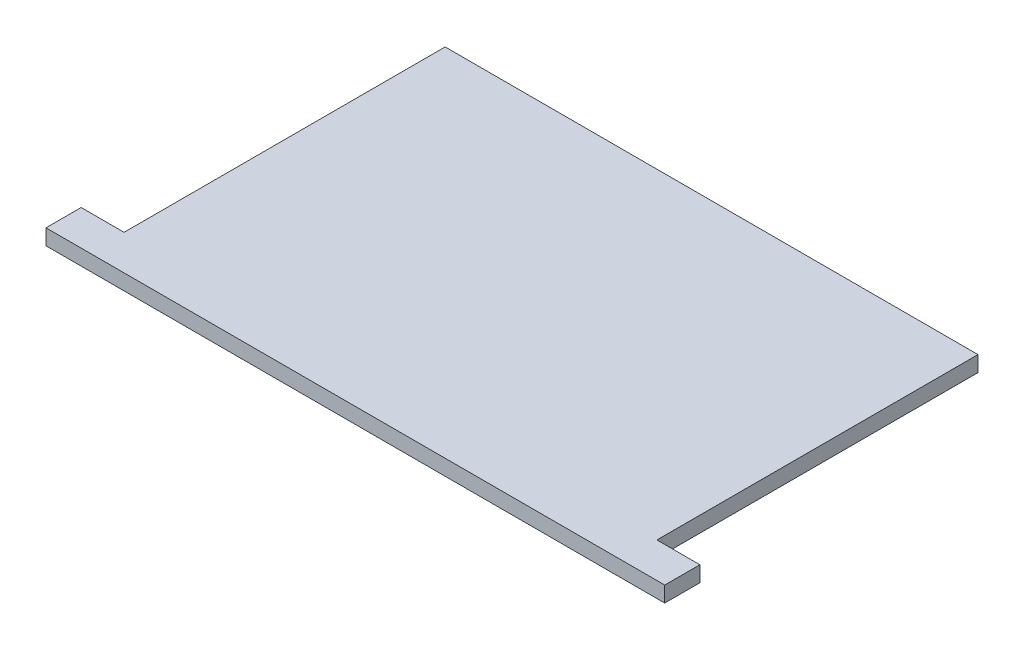
ISO-10303-21;
HEADER;
FILE_DESCRIPTION(('STEP AP214'),'2;1');
FILE_NAME('part.step','',(''),(''),'','','');
FILE_SCHEMA(('AUTOMOTIVE_DESIGN { 1 0 10303 214 1 1 1 1 }'));
ENDSEC;
DATA;
#1=APPLICATION_CONTEXT('core data for automotive mechanical design processes');
#2=APPLICATION_PROTOCOL_DEFINITION('international standard','automotive_design',2000,#1);
#3=PRODUCT_CONTEXT('',#1,'mechanical');
#4=PRODUCT('Part','Part','',(#3));
#5=PRODUCT_RELATED_PRODUCT_CATEGORY('part','',(#4));
#6=PRODUCT_DEFINITION_FORMATION('','',#4);
#7=PRODUCT_DEFINITION_CONTEXT('part definition',#1,'design');
#8=PRODUCT_DEFINITION('design','',#6,#7);
#9=PRODUCT_DEFINITION_SHAPE('','',#8);
#10=(LENGTH_UNIT() NAMED_UNIT(*) SI_UNIT(.MILLI.,.METRE.));
#11=(NAMED_UNIT(*) PLANE_ANGLE_UNIT() SI_UNIT($,.RADIAN.));
#12=(NAMED_UNIT(*) SI_UNIT($,.STERADIAN.) SOLID_ANGLE_UNIT());
#13=UNCERTAINTY_MEASURE_WITH_UNIT(LENGTH_MEASURE(1.E-05),#10,'distance_accuracy_value','');
#14=(GEOMETRIC_REPRESENTATION_CONTEXT(3) GLOBAL_UNCERTAINTY_ASSIGNED_CONTEXT((#13)) GLOBAL_UNIT_ASSIGNED_CONTEXT((#10,
#11,#12)) REPRESENTATION_CONTEXT('',''));
#15=CARTESIAN_POINT('',(0.,0.,0.));
#16=DIRECTION('',(0.,0.,1.));
#17=DIRECTION('',(1.,0.,0.));
#18=AXIS2_PLACEMENT_3D('',#15,#16,#17);
#19=CARTESIAN_POINT('',(-158.5,0.,73.25));
#20=DIRECTION('',(0.,0.,1.));
#21=DIRECTION('',(1.,0.,0.));
#22=AXIS2_PLACEMENT_3D('',#19,#20,#21);
#23=PLANE('',#22);
#24=DIRECTION('',(1.,0.,0.));
#25=VECTOR('',#24,1.);
#26=CARTESIAN_POINT('',(-158.5,0.,73.25));
#27=LINE('',#26,#25);
#28=CARTESIAN_POINT('',(136.5,0.,73.2499999999998));
#29=VERTEX_POINT('',#28);
#30=CARTESIAN_POINT('',(158.5,0.,73.25));
#31=VERTEX_POINT('',#30);
#32=EDGE_CURVE('E185',#29,#31,#27,.T.);
#33=ORIENTED_EDGE('',*,*,#32,.F.);
#34=DIRECTION('',(0.,1.,0.));
#35=VECTOR('',#34,1.);
#36=CARTESIAN_POINT('',(136.5,0.,73.25));
#37=LINE('',#36,#35);
#38=CARTESIAN_POINT('',(136.5,8.,73.25));
#39=VERTEX_POINT('',#38);
#40=EDGE_CURVE('E179',#29,#39,#37,.T.);
#41=ORIENTED_EDGE('',*,*,#40,.T.);
#42=DIRECTION('',(1.,0.,0.));
#43=VECTOR('',#42,1.);
#44=CARTESIAN_POINT('',(158.5,8.,73.25));
#45=LINE('',#44,#43);
#46=CARTESIAN_POINT('',(158.5,8.,73.25));
#47=VERTEX_POINT('',#46);
#48=EDGE_CURVE('E173',#39,#47,#45,.T.);
#49=ORIENTED_EDGE('',*,*,#48,.T.);
#50=DIRECTION('',(0.,1.,0.));
#51=VECTOR('',#50,1.);
#52=CARTESIAN_POINT('',(158.5,0.,73.25));
#53=LINE('',#52,#51);
#54=EDGE_CURVE('E175',#31,#47,#53,.T.);
#55=ORIENTED_EDGE('',*,*,#54,.F.);
#56=EDGE_LOOP('',(#33,#41,#49,#55));
#57=FACE_BOUND('',#56,.T.);
#58=ADVANCED_FACE('F35',(#57),#23,.F.);
#59=DIRECTION('',(0.,1.,0.));
#60=VECTOR('',#59,1.);
#61=CARTESIAN_POINT('',(116.5,0.,73.25));
#62=LINE('',#61,#60);
#63=CARTESIAN_POINT('',(116.5,0.,73.2499999999998));
#64=VERTEX_POINT('',#63);
#65=CARTESIAN_POINT('',(116.5,6.,73.25));
#66=VERTEX_POINT('',#65);
#67=EDGE_CURVE('E141',#64,#66,#62,.T.);
#68=ORIENTED_EDGE('',*,*,#67,.F.);
#69=CARTESIAN_POINT('',(-116.5,0.,73.25));
#70=VERTEX_POINT('',#69);
#71=EDGE_CURVE('E132',#70,#64,#27,.T.);
#72=ORIENTED_EDGE('',*,*,#71,.F.);
#73=DIRECTION('',(0.,1.,0.));
#74=VECTOR('',#73,1.);
#75=CARTESIAN_POINT('',(-116.5,0.,73.25));
#76=LINE('',#75,#74);
#77=CARTESIAN_POINT('',(-116.5,6.,73.25));
#78=VERTEX_POINT('',#77);
#79=EDGE_CURVE('E159',#70,#78,#76,.T.);
#80=ORIENTED_EDGE('',*,*,#79,.T.);
#81=DIRECTION('',(-1.,0.,0.));
#82=VECTOR('',#81,1.);
#83=CARTESIAN_POINT('',(-136.5,6.,73.25));
#84=LINE('',#83,#82);
#85=EDGE_CURVE('E168',#66,#78,#84,.T.);
#86=ORIENTED_EDGE('',*,*,#85,.F.);
#87=EDGE_LOOP('',(#68,#72,#80,#86));
#88=FACE_BOUND('',#87,.T.);
#89=ADVANCED_FACE('F247',(#88),#23,.F.);
#90=CARTESIAN_POINT('',(0.,6.,0.));
#91=DIRECTION('',(0.,1.,0.));
#92=DIRECTION('',(0.,0.,1.));
#93=AXIS2_PLACEMENT_3D('',#90,#91,#92);
#94=PLANE('',#93);
#95=DIRECTION('',(0.,0.,-1.));
#96=VECTOR('',#95,1.);
#97=CARTESIAN_POINT('',(116.5,6.,73.25));
#98=LINE('',#97,#96);
#99=CARTESIAN_POINT('',(116.5,6.,-91.25));
#100=VERTEX_POINT('',#99);
#101=EDGE_CURVE('E50',#66,#100,#98,.T.);
#102=ORIENTED_EDGE('',*,*,#101,.F.);
#103=ORIENTED_EDGE('',*,*,#85,.T.);
#104=DIRECTION('',(0.,0.,1.));
#105=VECTOR('',#104,1.);
#106=CARTESIAN_POINT('',(-116.5,6.,-91.25));
#107=LINE('',#106,#105);
#108=CARTESIAN_POINT('',(-116.5,6.,-91.25));
#109=VERTEX_POINT('',#108);
#110=EDGE_CURVE('E151',#109,#78,#107,.T.);
#111=ORIENTED_EDGE('',*,*,#110,.F.);
#112=DIRECTION('',(1.,0.,0.));
#113=VECTOR('',#112,1.);
#114=CARTESIAN_POINT('',(-136.5,6.,-91.25));
#115=LINE('',#114,#113);
#116=EDGE_CURVE('E55',#109,#100,#115,.T.);
#117=ORIENTED_EDGE('',*,*,#116,.T.);
#118=EDGE_LOOP('',(#102,#103,#111,#117));
#119=FACE_BOUND('',#118,.T.);
#120=ADVANCED_FACE('F248',(#119),#94,.F.);
#121=DIRECTION('',(0.,1.,0.));
#122=VECTOR('',#121,1.);
#123=CARTESIAN_POINT('',(-136.5,0.,73.25));
#124=LINE('',#123,#122);
#125=CARTESIAN_POINT('',(-136.5,0.,73.25));
#126=VERTEX_POINT('',#125);
#127=CARTESIAN_POINT('',(-136.5,8.,73.25));
#128=VERTEX_POINT('',#127);
#129=EDGE_CURVE('E194',#126,#128,#124,.T.);
#130=ORIENTED_EDGE('',*,*,#129,.F.);
#131=CARTESIAN_POINT('',(-158.5,0.,73.25));
#132=VERTEX_POINT('',#131);
#133=EDGE_CURVE('E182',#132,#126,#27,.T.);
#134=ORIENTED_EDGE('',*,*,#133,.F.);
#135=DIRECTION('',(0.,1.,0.));
#136=VECTOR('',#135,1.);
#137=CARTESIAN_POINT('',(-158.5,0.,73.25));
#138=LINE('',#137,#136);
#139=CARTESIAN_POINT('',(-158.5,8.,73.25));
#140=VERTEX_POINT('',#139);
#141=EDGE_CURVE('E184',#132,#140,#138,.T.);
#142=ORIENTED_EDGE('',*,*,#141,.T.);
#143=DIRECTION('',(1.,0.,0.));
#144=VECTOR('',#143,1.);
#145=CARTESIAN_POINT('',(-158.5,8.,73.25));
#146=LINE('',#145,#144);
#147=EDGE_CURVE('E178',#140,#128,#146,.T.);
#148=ORIENTED_EDGE('',*,*,#147,.T.);
#149=EDGE_LOOP('',(#130,#134,#142,#148));
#150=FACE_BOUND('',#149,.T.);
#151=ADVANCED_FACE('F250',(#150),#23,.F.);
#152=CARTESIAN_POINT('',(158.5,8.,91.25));
#153=DIRECTION('',(-1.,0.,0.));
#154=DIRECTION('',(0.,0.,1.));
#155=AXIS2_PLACEMENT_3D('',#152,#153,#154);
#156=PLANE('',#155);
#157=DIRECTION('',(0.,0.,-1.));
#158=VECTOR('',#157,1.);
#159=CARTESIAN_POINT('',(158.5,0.,91.25));
#160=LINE('',#159,#158);
#161=CARTESIAN_POINT('',(158.5,0.,91.25));
#162=VERTEX_POINT('',#161);
#163=EDGE_CURVE('E193',#162,#31,#160,.T.);
#164=ORIENTED_EDGE('',*,*,#163,.T.);
#165=ORIENTED_EDGE('',*,*,#54,.T.);
#166=DIRECTION('',(0.,0.,-1.));
#167=VECTOR('',#166,1.);
#168=CARTESIAN_POINT('',(158.5,8.,91.25));
#169=LINE('',#168,#167);
#170=CARTESIAN_POINT('',(158.5,8.,91.25));
#171=VERTEX_POINT('',#170);
#172=EDGE_CURVE('E197',#171,#47,#169,.T.);
#173=ORIENTED_EDGE('',*,*,#172,.F.);
#174=DIRECTION('',(0.,-1.,0.));
#175=VECTOR('',#174,1.);
#176=CARTESIAN_POINT('',(158.5,8.,91.25));
#177=LINE('',#176,#175);
#178=EDGE_CURVE('E43',#171,#162,#177,.T.);
#179=ORIENTED_EDGE('',*,*,#178,.T.);
#180=EDGE_LOOP('',(#164,#165,#173,#179));
#181=FACE_BOUND('',#180,.T.);
#182=ADVANCED_FACE('F37',(#181),#156,.F.);
#183=CARTESIAN_POINT('',(-158.5,8.,-91.25));
#184=DIRECTION('',(0.,0.,1.));
#185=DIRECTION('',(1.,0.,0.));
#186=AXIS2_PLACEMENT_3D('',#183,#184,#185);
#187=PLANE('',#186);
#188=DIRECTION('',(0.,1.,0.));
#189=VECTOR('',#188,1.);
#190=CARTESIAN_POINT('',(136.5,0.,-91.25));
#191=LINE('',#190,#189);
#192=CARTESIAN_POINT('',(136.5,0.,-91.25));
#193=VERTEX_POINT('',#192);
#194=CARTESIAN_POINT('',(136.5,8.,-91.25));
#195=VERTEX_POINT('',#194);
#196=EDGE_CURVE('E145',#193,#195,#191,.T.);
#197=ORIENTED_EDGE('',*,*,#196,.F.);
#198=DIRECTION('',(1.,0.,0.));
#199=VECTOR('',#198,1.);
#200=CARTESIAN_POINT('',(136.5,0.,-91.25));
#201=LINE('',#200,#199);
#202=CARTESIAN_POINT('',(116.5,0.,-91.25));
#203=VERTEX_POINT('',#202);
#204=EDGE_CURVE('E129',#203,#193,#201,.T.);
#205=ORIENTED_EDGE('',*,*,#204,.F.);
#206=DIRECTION('',(0.,1.,0.));
#207=VECTOR('',#206,1.);
#208=CARTESIAN_POINT('',(116.5,0.,-91.25));
#209=LINE('',#208,#207);
#210=EDGE_CURVE('E138',#203,#100,#209,.T.);
#211=ORIENTED_EDGE('',*,*,#210,.T.);
#212=ORIENTED_EDGE('',*,*,#116,.F.);
#213=DIRECTION('',(0.,1.,0.));
#214=VECTOR('',#213,1.);
#215=CARTESIAN_POINT('',(-116.5,0.,-91.25));
#216=LINE('',#215,#214);
#217=CARTESIAN_POINT('',(-116.5,0.,-91.25));
#218=VERTEX_POINT('',#217);
#219=EDGE_CURVE('E164',#218,#109,#216,.T.);
#220=ORIENTED_EDGE('',*,*,#219,.F.);
#221=DIRECTION('',(1.,0.,0.));
#222=VECTOR('',#221,1.);
#223=CARTESIAN_POINT('',(-136.5,0.,-91.25));
#224=LINE('',#223,#222);
#225=CARTESIAN_POINT('',(-136.5,0.,-91.25));
#226=VERTEX_POINT('',#225);
#227=EDGE_CURVE('E155',#226,#218,#224,.T.);
#228=ORIENTED_EDGE('',*,*,#227,.F.);
#229=DIRECTION('',(0.,1.,0.));
#230=VECTOR('',#229,1.);
#231=CARTESIAN_POINT('',(-136.5,0.,-91.25));
#232=LINE('',#231,#230);
#233=CARTESIAN_POINT('',(-136.5,8.,-91.25));
#234=VERTEX_POINT('',#233);
#235=EDGE_CURVE('E191',#226,#234,#232,.T.);
#236=ORIENTED_EDGE('',*,*,#235,.T.);
#237=DIRECTION('',(-1.,0.,0.));
#238=VECTOR('',#237,1.);
#239=CARTESIAN_POINT('',(-158.5,8.,-91.25));
#240=LINE('',#239,#238);
#241=EDGE_CURVE('E200',#195,#234,#240,.T.);
#242=ORIENTED_EDGE('',*,*,#241,.F.);
#243=EDGE_LOOP('',(#197,#205,#211,#212,#220,#228,#236,#242));
#244=FACE_BOUND('',#243,.T.);
#245=ADVANCED_FACE('F143',(#244),#187,.F.);
#246=CARTESIAN_POINT('',(-158.5,8.,91.25));
#247=DIRECTION('',(1.,0.,0.));
#248=DIRECTION('',(0.,0.,-1.));
#249=AXIS2_PLACEMENT_3D('',#246,#247,#248);
#250=PLANE('',#249);
#251=DIRECTION('',(0.,0.,1.));
#252=VECTOR('',#251,1.);
#253=CARTESIAN_POINT('',(-158.5,8.,91.25));
#254=LINE('',#253,#252);
#255=CARTESIAN_POINT('',(-158.5,8.,91.25));
#256=VERTEX_POINT('',#255);
#257=EDGE_CURVE('E204',#140,#256,#254,.T.);
#258=ORIENTED_EDGE('',*,*,#257,.F.);
#259=ORIENTED_EDGE('',*,*,#141,.F.);
#260=DIRECTION('',(0.,0.,1.));
#261=VECTOR('',#260,1.);
#262=CARTESIAN_POINT('',(-158.5,0.,91.25));
#263=LINE('',#262,#261);
#264=CARTESIAN_POINT('',(-158.5,0.,91.25));
#265=VERTEX_POINT('',#264);
#266=EDGE_CURVE('E210',#132,#265,#263,.T.);
#267=ORIENTED_EDGE('',*,*,#266,.T.);
#268=DIRECTION('',(0.,-1.,0.));
#269=VECTOR('',#268,1.);
#270=CARTESIAN_POINT('',(-158.5,8.,91.25));
#271=LINE('',#270,#269);
#272=EDGE_CURVE('E11',#256,#265,#271,.T.);
#273=ORIENTED_EDGE('',*,*,#272,.F.);
#274=EDGE_LOOP('',(#258,#259,#267,#273));
#275=FACE_BOUND('',#274,.T.);
#276=ADVANCED_FACE('F233',(#275),#250,.F.);
#277=CARTESIAN_POINT('',(-158.5,8.,91.25));
#278=DIRECTION('',(0.,0.,-1.));
#279=DIRECTION('',(-1.,0.,0.));
#280=AXIS2_PLACEMENT_3D('',#277,#278,#279);
#281=PLANE('',#280);
#282=DIRECTION('',(1.,0.,0.));
#283=VECTOR('',#282,1.);
#284=CARTESIAN_POINT('',(-158.5,0.,91.25));
#285=LINE('',#284,#283);
#286=EDGE_CURVE('E201',#265,#162,#285,.T.);
#287=ORIENTED_EDGE('',*,*,#286,.T.);
#288=ORIENTED_EDGE('',*,*,#178,.F.);
#289=DIRECTION('',(1.,0.,0.));
#290=VECTOR('',#289,1.);
#291=CARTESIAN_POINT('',(-158.5,8.,91.25));
#292=LINE('',#291,#290);
#293=EDGE_CURVE('E206',#256,#171,#292,.T.);
#294=ORIENTED_EDGE('',*,*,#293,.F.);
#295=ORIENTED_EDGE('',*,*,#272,.T.);
#296=EDGE_LOOP('',(#287,#288,#294,#295));
#297=FACE_BOUND('',#296,.T.);
#298=ADVANCED_FACE('F231',(#297),#281,.F.);
#299=CARTESIAN_POINT('',(0.,8.,0.));
#300=DIRECTION('',(0.,-1.,0.));
#301=DIRECTION('',(0.,0.,-1.));
#302=AXIS2_PLACEMENT_3D('',#299,#300,#301);
#303=PLANE('',#302);
#304=ORIENTED_EDGE('',*,*,#172,.T.);
#305=ORIENTED_EDGE('',*,*,#48,.F.);
#306=DIRECTION('',(0.,0.,1.));
#307=VECTOR('',#306,1.);
#308=CARTESIAN_POINT('',(136.5,8.,73.25));
#309=LINE('',#308,#307);
#310=EDGE_CURVE('E170',#195,#39,#309,.T.);
#311=ORIENTED_EDGE('',*,*,#310,.F.);
#312=ORIENTED_EDGE('',*,*,#241,.T.);
#313=DIRECTION('',(0.,0.,-1.));
#314=VECTOR('',#313,1.);
#315=CARTESIAN_POINT('',(-136.5,8.,73.25));
#316=LINE('',#315,#314);
#317=EDGE_CURVE('E188',#128,#234,#316,.T.);
#318=ORIENTED_EDGE('',*,*,#317,.F.);
#319=ORIENTED_EDGE('',*,*,#147,.F.);
#320=ORIENTED_EDGE('',*,*,#257,.T.);
#321=ORIENTED_EDGE('',*,*,#293,.T.);
#322=EDGE_LOOP('',(#304,#305,#311,#312,#318,#319,#320,#321));
#323=FACE_BOUND('',#322,.T.);
#324=ADVANCED_FACE('F226',(#323),#303,.F.);
#325=CARTESIAN_POINT('',(0.,0.,0.));
#326=DIRECTION('',(0.,-1.,0.));
#327=DIRECTION('',(0.,0.,-1.));
#328=AXIS2_PLACEMENT_3D('',#325,#326,#327);
#329=PLANE('',#328);
#330=ORIENTED_EDGE('',*,*,#133,.T.);
#331=DIRECTION('',(0.,0.,-1.));
#332=VECTOR('',#331,1.);
#333=CARTESIAN_POINT('',(-136.5,0.,-91.25));
#334=LINE('',#333,#332);
#335=EDGE_CURVE('E152',#126,#226,#334,.T.);
#336=ORIENTED_EDGE('',*,*,#335,.T.);
#337=ORIENTED_EDGE('',*,*,#227,.T.);
#338=DIRECTION('',(0.,0.,1.));
#339=VECTOR('',#338,1.);
#340=CARTESIAN_POINT('',(-116.5,0.,-91.25));
#341=LINE('',#340,#339);
#342=EDGE_CURVE('E157',#218,#70,#341,.T.);
#343=ORIENTED_EDGE('',*,*,#342,.T.);
#344=ORIENTED_EDGE('',*,*,#71,.T.);
#345=DIRECTION('',(0.,0.,-1.));
#346=VECTOR('',#345,1.);
#347=CARTESIAN_POINT('',(116.5,0.,73.25));
#348=LINE('',#347,#346);
#349=EDGE_CURVE('E123',#64,#203,#348,.T.);
#350=ORIENTED_EDGE('',*,*,#349,.T.);
#351=ORIENTED_EDGE('',*,*,#204,.T.);
#352=DIRECTION('',(0.,0.,1.));
#353=VECTOR('',#352,1.);
#354=CARTESIAN_POINT('',(136.5,0.,73.25));
#355=LINE('',#354,#353);
#356=EDGE_CURVE('E135',#193,#29,#355,.T.);
#357=ORIENTED_EDGE('',*,*,#356,.T.);
#358=ORIENTED_EDGE('',*,*,#32,.T.);
#359=ORIENTED_EDGE('',*,*,#163,.F.);
#360=ORIENTED_EDGE('',*,*,#286,.F.);
#361=ORIENTED_EDGE('',*,*,#266,.F.);
#362=EDGE_LOOP('',(#330,#336,#337,#343,#344,#350,#351,#357,#358,#359,#360,#361));
#363=FACE_BOUND('',#362,.T.);
#364=ADVANCED_FACE('F126',(#363),#329,.T.);
#365=CARTESIAN_POINT('',(-136.5,0.,73.25));
#366=DIRECTION('',(1.,0.,0.));
#367=DIRECTION('',(0.,0.,-1.));
#368=AXIS2_PLACEMENT_3D('',#365,#366,#367);
#369=PLANE('',#368);
#370=ORIENTED_EDGE('',*,*,#235,.F.);
#371=ORIENTED_EDGE('',*,*,#335,.F.);
#372=ORIENTED_EDGE('',*,*,#129,.T.);
#373=ORIENTED_EDGE('',*,*,#317,.T.);
#374=EDGE_LOOP('',(#370,#371,#372,#373));
#375=FACE_BOUND('',#374,.T.);
#376=ADVANCED_FACE('F238',(#375),#369,.F.);
#377=CARTESIAN_POINT('',(136.5,0.,73.25));
#378=DIRECTION('',(-1.,0.,0.));
#379=DIRECTION('',(0.,0.,1.));
#380=AXIS2_PLACEMENT_3D('',#377,#378,#379);
#381=PLANE('',#380);
#382=ORIENTED_EDGE('',*,*,#40,.F.);
#383=ORIENTED_EDGE('',*,*,#356,.F.);
#384=ORIENTED_EDGE('',*,*,#196,.T.);
#385=ORIENTED_EDGE('',*,*,#310,.T.);
#386=EDGE_LOOP('',(#382,#383,#384,#385));
#387=FACE_BOUND('',#386,.T.);
#388=ADVANCED_FACE('F308',(#387),#381,.F.);
#389=CARTESIAN_POINT('',(-116.5,0.,-91.25));
#390=DIRECTION('',(-1.,0.,0.));
#391=DIRECTION('',(0.,0.,1.));
#392=AXIS2_PLACEMENT_3D('',#389,#390,#391);
#393=PLANE('',#392);
#394=ORIENTED_EDGE('',*,*,#110,.T.);
#395=ORIENTED_EDGE('',*,*,#79,.F.);
#396=ORIENTED_EDGE('',*,*,#342,.F.);
#397=ORIENTED_EDGE('',*,*,#219,.T.);
#398=EDGE_LOOP('',(#394,#395,#396,#397));
#399=FACE_BOUND('',#398,.T.);
#400=ADVANCED_FACE('F245',(#399),#393,.F.);
#401=CARTESIAN_POINT('',(116.5,0.,73.25));
#402=DIRECTION('',(1.,0.,0.));
#403=DIRECTION('',(0.,0.,-1.));
#404=AXIS2_PLACEMENT_3D('',#401,#402,#403);
#405=PLANE('',#404);
#406=ORIENTED_EDGE('',*,*,#101,.T.);
#407=ORIENTED_EDGE('',*,*,#210,.F.);
#408=ORIENTED_EDGE('',*,*,#349,.F.);
#409=ORIENTED_EDGE('',*,*,#67,.T.);
#410=EDGE_LOOP('',(#406,#407,#408,#409));
#411=FACE_BOUND('',#410,.T.);
#412=ADVANCED_FACE('F139',(#411),#405,.F.);
#413=CLOSED_SHELL('',(#58,#89,#120,#151,#182,#245,#276,#298,#324,#364,#376,#388,#400,#412));
#414=MANIFOLD_SOLID_BREP('B2',#413);
#415=ADVANCED_BREP_SHAPE_REPRESENTATION('',(#18,#414),#14);
#416=SHAPE_DEFINITION_REPRESENTATION(#9,#415);
ENDSEC;
END-ISO-10303-21;
